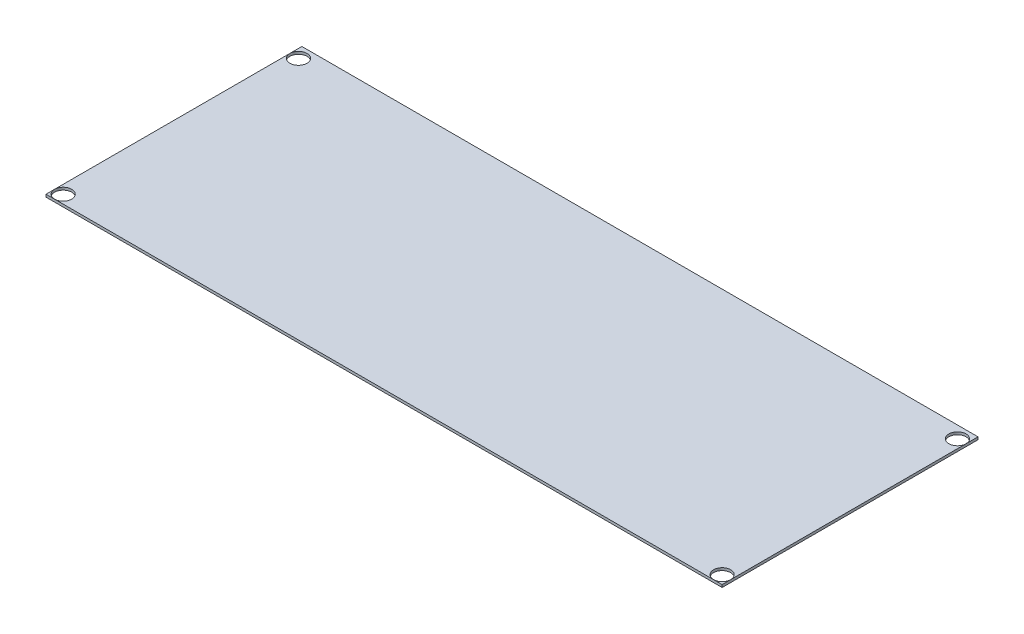
ISO-10303-21;
HEADER;
FILE_DESCRIPTION(('STEP AP214'),'2;1');
FILE_NAME('part.step','',(''),(''),'','','');
FILE_SCHEMA(('AUTOMOTIVE_DESIGN { 1 0 10303 214 1 1 1 1 }'));
ENDSEC;
DATA;
#1=APPLICATION_CONTEXT('core data for automotive mechanical design processes');
#2=APPLICATION_PROTOCOL_DEFINITION('international standard','automotive_design',2000,#1);
#3=PRODUCT_CONTEXT('',#1,'mechanical');
#4=PRODUCT('Part','Part','',(#3));
#5=PRODUCT_RELATED_PRODUCT_CATEGORY('part','',(#4));
#6=PRODUCT_DEFINITION_FORMATION('','',#4);
#7=PRODUCT_DEFINITION_CONTEXT('part definition',#1,'design');
#8=PRODUCT_DEFINITION('design','',#6,#7);
#9=PRODUCT_DEFINITION_SHAPE('','',#8);
#10=(LENGTH_UNIT() NAMED_UNIT(*) SI_UNIT(.MILLI.,.METRE.));
#11=(NAMED_UNIT(*) PLANE_ANGLE_UNIT() SI_UNIT($,.RADIAN.));
#12=(NAMED_UNIT(*) SI_UNIT($,.STERADIAN.) SOLID_ANGLE_UNIT());
#13=UNCERTAINTY_MEASURE_WITH_UNIT(LENGTH_MEASURE(1.E-05),#10,'distance_accuracy_value','');
#14=(GEOMETRIC_REPRESENTATION_CONTEXT(3) GLOBAL_UNCERTAINTY_ASSIGNED_CONTEXT((#13)) GLOBAL_UNIT_ASSIGNED_CONTEXT((#10,
#11,#12)) REPRESENTATION_CONTEXT('',''));
#15=CARTESIAN_POINT('',(0.,0.,0.));
#16=DIRECTION('',(0.,0.,1.));
#17=DIRECTION('',(1.,0.,0.));
#18=AXIS2_PLACEMENT_3D('',#15,#16,#17);
#19=CARTESIAN_POINT('',(4.44089209850063E-13,1.24359290226694E-10,0.));
#20=DIRECTION('',(0.,0.,-1.));
#21=DIRECTION('',(1.,6.22399701222243E-13,0.));
#22=AXIS2_PLACEMENT_3D('',#19,#20,#21);
#23=PLANE('',#22);
#24=DIRECTION('',(-1.,-6.22399701222243E-13,0.));
#25=VECTOR('',#24,1.);
#26=CARTESIAN_POINT('',(-1.4432899320127E-12,3.00000000012436,0.));
#27=LINE('',#26,#25);
#28=CARTESIAN_POINT('',(395.01,3.00000000037021,0.));
#29=VERTEX_POINT('',#28);
#30=CARTESIAN_POINT('',(-395.010000000001,2.99999999987845,0.));
#31=VERTEX_POINT('',#30);
#32=EDGE_CURVE('E128',#29,#31,#27,.T.);
#33=ORIENTED_EDGE('',*,*,#32,.T.);
#34=DIRECTION('',(-6.29126380620922E-13,1.,0.));
#35=VECTOR('',#34,1.);
#36=CARTESIAN_POINT('',(-395.009999999999,-1.21550614885779E-10,0.));
#37=LINE('',#36,#35);
#38=CARTESIAN_POINT('',(-395.009999999999,-1.21550614885779E-10,0.));
#39=VERTEX_POINT('',#38);
#40=EDGE_CURVE('E61',#39,#31,#37,.T.);
#41=ORIENTED_EDGE('',*,*,#40,.F.);
#42=DIRECTION('',(-1.,-6.22399701222243E-13,0.));
#43=VECTOR('',#42,1.);
#44=CARTESIAN_POINT('',(4.44089209850063E-13,1.24359290226694E-10,0.));
#45=LINE('',#44,#43);
#46=CARTESIAN_POINT('',(395.01,3.70213396206492E-10,0.));
#47=VERTEX_POINT('',#46);
#48=EDGE_CURVE('E87',#47,#39,#45,.T.);
#49=ORIENTED_EDGE('',*,*,#48,.F.);
#50=DIRECTION('',(0.,-1.,0.));
#51=VECTOR('',#50,1.);
#52=CARTESIAN_POINT('',(395.01,3.,0.));
#53=LINE('',#52,#51);
#54=EDGE_CURVE('E102',#29,#47,#53,.T.);
#55=ORIENTED_EDGE('',*,*,#54,.F.);
#56=EDGE_LOOP('',(#33,#41,#49,#55));
#57=FACE_BOUND('',#56,.T.);
#58=ADVANCED_FACE('F42',(#57),#23,.F.);
#59=CARTESIAN_POINT('',(4.9960036108132E-13,1.24359290226694E-10,-299.));
#60=DIRECTION('',(0.,0.,1.));
#61=DIRECTION('',(-1.,-6.22399701222243E-13,0.));
#62=AXIS2_PLACEMENT_3D('',#59,#60,#61);
#63=PLANE('',#62);
#64=DIRECTION('',(1.,6.22399701222243E-13,0.));
#65=VECTOR('',#64,1.);
#66=CARTESIAN_POINT('',(4.9960036108132E-13,1.24359290226694E-10,-299.));
#67=LINE('',#66,#65);
#68=CARTESIAN_POINT('',(-395.009999999999,-1.21550658253866E-10,-299.));
#69=VERTEX_POINT('',#68);
#70=CARTESIAN_POINT('',(395.01,3.70213396206492E-10,-299.));
#71=VERTEX_POINT('',#70);
#72=EDGE_CURVE('E52',#69,#71,#67,.T.);
#73=ORIENTED_EDGE('',*,*,#72,.F.);
#74=DIRECTION('',(6.23767765351557E-13,-1.,0.));
#75=VECTOR('',#74,1.);
#76=CARTESIAN_POINT('',(-395.009999999999,-1.21550658253866E-10,-299.));
#77=LINE('',#76,#75);
#78=CARTESIAN_POINT('',(-395.010000000001,2.99999999987845,-299.));
#79=VERTEX_POINT('',#78);
#80=EDGE_CURVE('E73',#79,#69,#77,.T.);
#81=ORIENTED_EDGE('',*,*,#80,.F.);
#82=DIRECTION('',(1.,6.22399701222243E-13,0.));
#83=VECTOR('',#82,1.);
#84=CARTESIAN_POINT('',(-1.38777878078145E-12,3.00000000012436,-299.));
#85=LINE('',#84,#83);
#86=CARTESIAN_POINT('',(395.01,3.00000000037021,-299.));
#87=VERTEX_POINT('',#86);
#88=EDGE_CURVE('E93',#79,#87,#85,.T.);
#89=ORIENTED_EDGE('',*,*,#88,.T.);
#90=DIRECTION('',(0.,-1.,0.));
#91=VECTOR('',#90,1.);
#92=CARTESIAN_POINT('',(395.01,3.,-299.));
#93=LINE('',#92,#91);
#94=EDGE_CURVE('E91',#87,#71,#93,.T.);
#95=ORIENTED_EDGE('',*,*,#94,.T.);
#96=EDGE_LOOP('',(#73,#81,#89,#95));
#97=FACE_BOUND('',#96,.T.);
#98=ADVANCED_FACE('F89',(#97),#63,.F.);
#99=CARTESIAN_POINT('',(4.9960036108132E-13,1.24359290226694E-10,0.));
#100=DIRECTION('',(6.22399701222243E-13,-1.,0.));
#101=DIRECTION('',(0.,0.,1.));
#102=AXIS2_PLACEMENT_3D('',#99,#100,#101);
#103=PLANE('',#102);
#104=DIRECTION('',(0.,0.,1.));
#105=VECTOR('',#104,1.);
#106=CARTESIAN_POINT('',(-395.009999999999,-1.21550658253866E-10,-299.));
#107=LINE('',#106,#105);
#108=EDGE_CURVE('E46',#69,#39,#107,.T.);
#109=ORIENTED_EDGE('',*,*,#108,.F.);
#110=ORIENTED_EDGE('',*,*,#72,.T.);
#111=DIRECTION('',(0.,0.,-1.));
#112=VECTOR('',#111,1.);
#113=CARTESIAN_POINT('',(395.01,0.,-300.));
#114=LINE('',#113,#112);
#115=EDGE_CURVE('E98',#47,#71,#114,.T.);
#116=ORIENTED_EDGE('',*,*,#115,.F.);
#117=ORIENTED_EDGE('',*,*,#48,.T.);
#118=EDGE_LOOP('',(#109,#110,#116,#117));
#119=FACE_BOUND('',#118,.T.);
#120=CARTESIAN_POINT('',(-384.999999999999,-1.15264568723017E-10,-10.0499999999999));
#121=DIRECTION('',(6.22399701222243E-13,-1.,0.));
#122=DIRECTION('',(0.,0.,1.));
#123=AXIS2_PLACEMENT_3D('',#120,#121,#122);
#124=CIRCLE('',#123,9.99999999999998);
#125=CARTESIAN_POINT('',(-384.999999999999,-1.15265436084755E-10,-0.0499999999999112));
#126=VERTEX_POINT('',#125);
#127=EDGE_CURVE('E122',#126,#126,#124,.T.);
#128=ORIENTED_EDGE('',*,*,#127,.F.);
#129=EDGE_LOOP('',(#128));
#130=FACE_BOUND('',#129,.T.);
#131=CARTESIAN_POINT('',(-384.999999999999,-1.15264568723017E-10,-285.));
#132=DIRECTION('',(6.22399701222243E-13,-1.,0.));
#133=DIRECTION('',(0.,0.,1.));
#134=AXIS2_PLACEMENT_3D('',#131,#132,#133);
#135=CIRCLE('',#134,9.99999999999998);
#136=CARTESIAN_POINT('',(-384.999999999999,-1.15265436084755E-10,-275.));
#137=VERTEX_POINT('',#136);
#138=EDGE_CURVE('E105',#137,#137,#135,.T.);
#139=ORIENTED_EDGE('',*,*,#138,.F.);
#140=EDGE_LOOP('',(#139));
#141=FACE_BOUND('',#140,.T.);
#142=CARTESIAN_POINT('',(385.,0.,-10.0499999999999));
#143=DIRECTION('',(0.,1.,0.));
#144=DIRECTION('',(0.,0.,1.));
#145=AXIS2_PLACEMENT_3D('',#142,#143,#144);
#146=CIRCLE('',#145,9.99999999999998);
#147=CARTESIAN_POINT('',(385.,0.,-0.0499999999999112));
#148=VERTEX_POINT('',#147);
#149=EDGE_CURVE('E101',#148,#148,#146,.T.);
#150=ORIENTED_EDGE('',*,*,#149,.T.);
#151=EDGE_LOOP('',(#150));
#152=FACE_BOUND('',#151,.T.);
#153=CARTESIAN_POINT('',(385.,0.,-285.));
#154=DIRECTION('',(0.,1.,0.));
#155=DIRECTION('',(0.,0.,1.));
#156=AXIS2_PLACEMENT_3D('',#153,#154,#155);
#157=CIRCLE('',#156,9.99999999999998);
#158=CARTESIAN_POINT('',(385.,0.,-275.));
#159=VERTEX_POINT('',#158);
#160=EDGE_CURVE('E115',#159,#159,#157,.T.);
#161=ORIENTED_EDGE('',*,*,#160,.T.);
#162=EDGE_LOOP('',(#161));
#163=FACE_BOUND('',#162,.T.);
#164=ADVANCED_FACE('F81',(#119,#130,#141,#152,#163),#103,.T.);
#165=CARTESIAN_POINT('',(-1.38777878078145E-12,3.00000000012436,0.));
#166=DIRECTION('',(6.22399701222243E-13,-1.,0.));
#167=DIRECTION('',(0.,0.,1.));
#168=AXIS2_PLACEMENT_3D('',#165,#166,#167);
#169=PLANE('',#168);
#170=CARTESIAN_POINT('',(-385.000000000001,2.99999999988473,-10.0499999999999));
#171=DIRECTION('',(6.22399701222243E-13,-1.,0.));
#172=DIRECTION('',(0.,0.,1.));
#173=AXIS2_PLACEMENT_3D('',#170,#171,#172);
#174=CIRCLE('',#173,9.99999999999998);
#175=CARTESIAN_POINT('',(-385.000000000001,2.99999999988473,-0.0499999999999112));
#176=VERTEX_POINT('',#175);
#177=EDGE_CURVE('E131',#176,#176,#174,.T.);
#178=ORIENTED_EDGE('',*,*,#177,.T.);
#179=EDGE_LOOP('',(#178));
#180=FACE_BOUND('',#179,.T.);
#181=CARTESIAN_POINT('',(-385.000000000001,2.99999999988473,-285.));
#182=DIRECTION('',(6.22399701222243E-13,-1.,0.));
#183=DIRECTION('',(0.,0.,1.));
#184=AXIS2_PLACEMENT_3D('',#181,#182,#183);
#185=CIRCLE('',#184,9.99999999999998);
#186=CARTESIAN_POINT('',(-385.000000000001,2.99999999988473,-275.));
#187=VERTEX_POINT('',#186);
#188=EDGE_CURVE('E125',#187,#187,#185,.T.);
#189=ORIENTED_EDGE('',*,*,#188,.T.);
#190=EDGE_LOOP('',(#189));
#191=FACE_BOUND('',#190,.T.);
#192=ORIENTED_EDGE('',*,*,#88,.F.);
#193=DIRECTION('',(0.,0.,1.));
#194=VECTOR('',#193,1.);
#195=CARTESIAN_POINT('',(-395.010000000001,2.99999999987845,0.));
#196=LINE('',#195,#194);
#197=EDGE_CURVE('E12',#79,#31,#196,.T.);
#198=ORIENTED_EDGE('',*,*,#197,.T.);
#199=ORIENTED_EDGE('',*,*,#32,.F.);
#200=DIRECTION('',(0.,0.,-1.));
#201=VECTOR('',#200,1.);
#202=CARTESIAN_POINT('',(395.01,3.,-300.));
#203=LINE('',#202,#201);
#204=EDGE_CURVE('E100',#29,#87,#203,.T.);
#205=ORIENTED_EDGE('',*,*,#204,.T.);
#206=EDGE_LOOP('',(#192,#198,#199,#205));
#207=FACE_BOUND('',#206,.T.);
#208=CARTESIAN_POINT('',(385.,3.,-10.0499999999999));
#209=DIRECTION('',(0.,1.,0.));
#210=DIRECTION('',(0.,0.,1.));
#211=AXIS2_PLACEMENT_3D('',#208,#209,#210);
#212=CIRCLE('',#211,9.99999999999998);
#213=CARTESIAN_POINT('',(385.,3.,-0.0499999999999112));
#214=VERTEX_POINT('',#213);
#215=EDGE_CURVE('E110',#214,#214,#212,.T.);
#216=ORIENTED_EDGE('',*,*,#215,.F.);
#217=EDGE_LOOP('',(#216));
#218=FACE_BOUND('',#217,.T.);
#219=CARTESIAN_POINT('',(385.,3.,-285.));
#220=DIRECTION('',(0.,1.,0.));
#221=DIRECTION('',(0.,0.,1.));
#222=AXIS2_PLACEMENT_3D('',#219,#220,#221);
#223=CIRCLE('',#222,9.99999999999998);
#224=CARTESIAN_POINT('',(385.,3.,-275.));
#225=VERTEX_POINT('',#224);
#226=EDGE_CURVE('E108',#225,#225,#223,.T.);
#227=ORIENTED_EDGE('',*,*,#226,.F.);
#228=EDGE_LOOP('',(#227));
#229=FACE_BOUND('',#228,.T.);
#230=ADVANCED_FACE('F136',(#180,#191,#207,#218,#229),#169,.F.);
#231=CARTESIAN_POINT('',(-385.000000000006,9.99999999988473,-285.));
#232=DIRECTION('',(6.22399701222243E-13,-1.,0.));
#233=DIRECTION('',(0.,0.,1.));
#234=AXIS2_PLACEMENT_3D('',#231,#232,#233);
#235=CYLINDRICAL_SURFACE('',#234,9.99999999999998);
#236=CARTESIAN_POINT('',(-384.999999999999,-1.15265436084755E-10,-275.));
#237=CARTESIAN_POINT('',(-384.999999999999,0.0312499998847346,-275.));
#238=CARTESIAN_POINT('',(-385.,0.0624999998847346,-275.));
#239=CARTESIAN_POINT('',(-385.,0.124999999884735,-275.));
#240=CARTESIAN_POINT('',(-385.,0.156249999884735,-275.));
#241=CARTESIAN_POINT('',(-385.,0.218749999884735,-275.));
#242=CARTESIAN_POINT('',(-385.,0.249999999884735,-275.));
#243=CARTESIAN_POINT('',(-385.,0.312499999884735,-275.));
#244=CARTESIAN_POINT('',(-385.,0.343749999884735,-275.));
#245=CARTESIAN_POINT('',(-385.,0.406249999884735,-275.));
#246=CARTESIAN_POINT('',(-385.,0.437499999884735,-275.));
#247=CARTESIAN_POINT('',(-385.,0.499999999884735,-275.));
#248=CARTESIAN_POINT('',(-385.,0.531249999884735,-275.));
#249=CARTESIAN_POINT('',(-385.,0.593749999884735,-275.));
#250=CARTESIAN_POINT('',(-385.,0.624999999884735,-275.));
#251=CARTESIAN_POINT('',(-385.,0.687499999884735,-275.));
#252=CARTESIAN_POINT('',(-385.,0.718749999884735,-275.));
#253=CARTESIAN_POINT('',(-385.,0.781249999884735,-275.));
#254=CARTESIAN_POINT('',(-385.,0.812499999884735,-275.));
#255=CARTESIAN_POINT('',(-385.,0.874999999884735,-275.));
#256=CARTESIAN_POINT('',(-385.,0.906249999884735,-275.));
#257=CARTESIAN_POINT('',(-385.,0.968749999884735,-275.));
#258=CARTESIAN_POINT('',(-385.,0.999999999884735,-275.));
#259=CARTESIAN_POINT('',(-385.,1.06249999988474,-275.));
#260=CARTESIAN_POINT('',(-385.,1.09374999988474,-275.));
#261=CARTESIAN_POINT('',(-385.,1.15624999988474,-275.));
#262=CARTESIAN_POINT('',(-385.,1.18749999988474,-275.));
#263=CARTESIAN_POINT('',(-385.,1.24999999988474,-275.));
#264=CARTESIAN_POINT('',(-385.,1.28124999988474,-275.));
#265=CARTESIAN_POINT('',(-385.,1.34374999988474,-275.));
#266=CARTESIAN_POINT('',(-385.,1.37499999988474,-275.));
#267=CARTESIAN_POINT('',(-385.,1.43749999988474,-275.));
#268=CARTESIAN_POINT('',(-385.,1.46874999988474,-275.));
#269=CARTESIAN_POINT('',(-385.,1.53124999988474,-275.));
#270=CARTESIAN_POINT('',(-385.000000000001,1.56249999988474,-275.));
#271=CARTESIAN_POINT('',(-385.000000000001,1.62499999988474,-275.));
#272=CARTESIAN_POINT('',(-385.000000000001,1.65624999988474,-275.));
#273=CARTESIAN_POINT('',(-385.000000000001,1.71874999988474,-275.));
#274=CARTESIAN_POINT('',(-385.000000000001,1.74999999988474,-275.));
#275=CARTESIAN_POINT('',(-385.000000000001,1.81249999988473,-275.));
#276=CARTESIAN_POINT('',(-385.000000000001,1.84374999988473,-275.));
#277=CARTESIAN_POINT('',(-385.000000000001,1.90624999988473,-275.));
#278=CARTESIAN_POINT('',(-385.000000000001,1.93749999988473,-275.));
#279=CARTESIAN_POINT('',(-385.000000000001,1.99999999988473,-275.));
#280=CARTESIAN_POINT('',(-385.000000000001,2.03124999988473,-275.));
#281=CARTESIAN_POINT('',(-385.000000000001,2.09374999988473,-275.));
#282=CARTESIAN_POINT('',(-385.000000000001,2.12499999988473,-275.));
#283=CARTESIAN_POINT('',(-385.000000000001,2.18749999988473,-275.));
#284=CARTESIAN_POINT('',(-385.000000000001,2.21874999988473,-275.));
#285=CARTESIAN_POINT('',(-385.000000000001,2.28124999988473,-275.));
#286=CARTESIAN_POINT('',(-385.000000000001,2.31249999988473,-275.));
#287=CARTESIAN_POINT('',(-385.000000000001,2.37499999988473,-275.));
#288=CARTESIAN_POINT('',(-385.000000000001,2.40624999988473,-275.));
#289=CARTESIAN_POINT('',(-385.000000000001,2.46874999988473,-275.));
#290=CARTESIAN_POINT('',(-385.000000000001,2.49999999988473,-275.));
#291=CARTESIAN_POINT('',(-385.000000000001,2.56249999988473,-275.));
#292=CARTESIAN_POINT('',(-385.000000000001,2.59374999988473,-275.));
#293=CARTESIAN_POINT('',(-385.000000000001,2.65624999988473,-275.));
#294=CARTESIAN_POINT('',(-385.000000000001,2.68749999988473,-275.));
#295=CARTESIAN_POINT('',(-385.000000000001,2.74999999988473,-275.));
#296=CARTESIAN_POINT('',(-385.000000000001,2.78124999988473,-275.));
#297=CARTESIAN_POINT('',(-385.000000000001,2.84374999988473,-275.));
#298=CARTESIAN_POINT('',(-385.000000000001,2.87499999988473,-275.));
#299=CARTESIAN_POINT('',(-385.000000000001,2.93749999988473,-275.));
#300=CARTESIAN_POINT('',(-385.000000000001,2.96874999988473,-275.));
#301=CARTESIAN_POINT('',(-385.000000000001,2.99999999988473,-275.));
#302=B_SPLINE_CURVE_WITH_KNOTS('',3,(#236,#237,#238,#239,#240,#241,#242,#243,#244,#245,#246,
#247,#248,#249,#250,#251,#252,#253,#254,#255,#256,#257,#258,#259,#260,#261,#262,#263,#264,#265,
#266,#267,#268,#269,#270,#271,#272,#273,#274,#275,#276,#277,#278,#279,#280,#281,#282,#283,#284,
#285,#286,#287,#288,#289,#290,#291,#292,#293,#294,#295,#296,#297,#298,#299,#300,#301),
.UNSPECIFIED.,.F.,.F.,(4,2,2,2,2,2,2,2,2,2,2,2,2,2,2,2,2,2,2,2,2,2,2,2,2,2,2,2,2,2,2,2,4),(0.,
0.0937500000000001,0.1875,0.28125,0.375,0.46875,0.5625,0.656250000000001,0.750000000000001,
0.843750000000001,0.937500000000001,1.03125,1.125,1.21875,1.3125,1.40625,1.5,1.59375,1.6875,
1.78125,1.875,1.96875,2.0625,2.15625,2.25,2.34375,2.4375,2.53125,2.625,2.71875,2.8125,2.90625,
3.),.UNSPECIFIED.);
#303=EDGE_CURVE('BSEAM142',#137,#187,#302,.T.);
#304=ORIENTED_EDGE('',*,*,#138,.T.);
#305=ORIENTED_EDGE('',*,*,#188,.F.);
#306=ORIENTED_EDGE('',*,*,#303,.T.);
#307=ORIENTED_EDGE('',*,*,#303,.F.);
#308=EDGE_LOOP('',(#304,#306,#305,#307));
#309=FACE_BOUND('',#308,.T.);
#310=ADVANCED_FACE('F142',(#309),#235,.F.);
#311=CARTESIAN_POINT('',(-385.000000000006,9.99999999988473,-10.0499999999999));
#312=DIRECTION('',(6.22399701222243E-13,-1.,0.));
#313=DIRECTION('',(0.,0.,1.));
#314=AXIS2_PLACEMENT_3D('',#311,#312,#313);
#315=CYLINDRICAL_SURFACE('',#314,9.99999999999998);
#316=CARTESIAN_POINT('',(-384.999999999999,-1.15265436084755E-10,-0.0499999999999112));
#317=CARTESIAN_POINT('',(-384.999999999999,0.0312499998847346,-0.0499999999999112));
#318=CARTESIAN_POINT('',(-385.,0.0624999998847346,-0.0499999999999112));
#319=CARTESIAN_POINT('',(-385.,0.124999999884735,-0.0499999999999112));
#320=CARTESIAN_POINT('',(-385.,0.156249999884735,-0.0499999999999112));
#321=CARTESIAN_POINT('',(-385.,0.218749999884735,-0.0499999999999112));
#322=CARTESIAN_POINT('',(-385.,0.249999999884735,-0.0499999999999112));
#323=CARTESIAN_POINT('',(-385.,0.312499999884735,-0.0499999999999112));
#324=CARTESIAN_POINT('',(-385.,0.343749999884735,-0.0499999999999112));
#325=CARTESIAN_POINT('',(-385.,0.406249999884735,-0.0499999999999112));
#326=CARTESIAN_POINT('',(-385.,0.437499999884735,-0.0499999999999112));
#327=CARTESIAN_POINT('',(-385.,0.499999999884735,-0.0499999999999112));
#328=CARTESIAN_POINT('',(-385.,0.531249999884735,-0.0499999999999112));
#329=CARTESIAN_POINT('',(-385.,0.593749999884735,-0.0499999999999112));
#330=CARTESIAN_POINT('',(-385.,0.624999999884735,-0.0499999999999112));
#331=CARTESIAN_POINT('',(-385.,0.687499999884735,-0.0499999999999112));
#332=CARTESIAN_POINT('',(-385.,0.718749999884735,-0.0499999999999112));
#333=CARTESIAN_POINT('',(-385.,0.781249999884735,-0.0499999999999112));
#334=CARTESIAN_POINT('',(-385.,0.812499999884735,-0.0499999999999112));
#335=CARTESIAN_POINT('',(-385.,0.874999999884735,-0.0499999999999112));
#336=CARTESIAN_POINT('',(-385.,0.906249999884735,-0.0499999999999112));
#337=CARTESIAN_POINT('',(-385.,0.968749999884735,-0.0499999999999112));
#338=CARTESIAN_POINT('',(-385.,0.999999999884735,-0.0499999999999112));
#339=CARTESIAN_POINT('',(-385.,1.06249999988474,-0.0499999999999112));
#340=CARTESIAN_POINT('',(-385.,1.09374999988474,-0.0499999999999112));
#341=CARTESIAN_POINT('',(-385.,1.15624999988474,-0.0499999999999112));
#342=CARTESIAN_POINT('',(-385.,1.18749999988474,-0.0499999999999112));
#343=CARTESIAN_POINT('',(-385.,1.24999999988474,-0.0499999999999112));
#344=CARTESIAN_POINT('',(-385.,1.28124999988474,-0.0499999999999112));
#345=CARTESIAN_POINT('',(-385.,1.34374999988474,-0.0499999999999112));
#346=CARTESIAN_POINT('',(-385.,1.37499999988474,-0.0499999999999112));
#347=CARTESIAN_POINT('',(-385.,1.43749999988474,-0.0499999999999112));
#348=CARTESIAN_POINT('',(-385.,1.46874999988474,-0.0499999999999112));
#349=CARTESIAN_POINT('',(-385.,1.53124999988474,-0.0499999999999112));
#350=CARTESIAN_POINT('',(-385.000000000001,1.56249999988474,-0.0499999999999112));
#351=CARTESIAN_POINT('',(-385.000000000001,1.62499999988474,-0.0499999999999112));
#352=CARTESIAN_POINT('',(-385.000000000001,1.65624999988474,-0.0499999999999112));
#353=CARTESIAN_POINT('',(-385.000000000001,1.71874999988474,-0.0499999999999112));
#354=CARTESIAN_POINT('',(-385.000000000001,1.74999999988474,-0.0499999999999112));
#355=CARTESIAN_POINT('',(-385.000000000001,1.81249999988473,-0.0499999999999112));
#356=CARTESIAN_POINT('',(-385.000000000001,1.84374999988473,-0.0499999999999112));
#357=CARTESIAN_POINT('',(-385.000000000001,1.90624999988473,-0.0499999999999112));
#358=CARTESIAN_POINT('',(-385.000000000001,1.93749999988473,-0.0499999999999112));
#359=CARTESIAN_POINT('',(-385.000000000001,1.99999999988473,-0.0499999999999112));
#360=CARTESIAN_POINT('',(-385.000000000001,2.03124999988473,-0.0499999999999112));
#361=CARTESIAN_POINT('',(-385.000000000001,2.09374999988473,-0.0499999999999112));
#362=CARTESIAN_POINT('',(-385.000000000001,2.12499999988473,-0.0499999999999112));
#363=CARTESIAN_POINT('',(-385.000000000001,2.18749999988473,-0.0499999999999112));
#364=CARTESIAN_POINT('',(-385.000000000001,2.21874999988473,-0.0499999999999112));
#365=CARTESIAN_POINT('',(-385.000000000001,2.28124999988473,-0.0499999999999112));
#366=CARTESIAN_POINT('',(-385.000000000001,2.31249999988473,-0.0499999999999112));
#367=CARTESIAN_POINT('',(-385.000000000001,2.37499999988473,-0.0499999999999112));
#368=CARTESIAN_POINT('',(-385.000000000001,2.40624999988473,-0.0499999999999112));
#369=CARTESIAN_POINT('',(-385.000000000001,2.46874999988473,-0.0499999999999112));
#370=CARTESIAN_POINT('',(-385.000000000001,2.49999999988473,-0.0499999999999112));
#371=CARTESIAN_POINT('',(-385.000000000001,2.56249999988473,-0.0499999999999112));
#372=CARTESIAN_POINT('',(-385.000000000001,2.59374999988473,-0.0499999999999112));
#373=CARTESIAN_POINT('',(-385.000000000001,2.65624999988473,-0.0499999999999112));
#374=CARTESIAN_POINT('',(-385.000000000001,2.68749999988473,-0.0499999999999112));
#375=CARTESIAN_POINT('',(-385.000000000001,2.74999999988473,-0.0499999999999112));
#376=CARTESIAN_POINT('',(-385.000000000001,2.78124999988473,-0.0499999999999112));
#377=CARTESIAN_POINT('',(-385.000000000001,2.84374999988473,-0.0499999999999112));
#378=CARTESIAN_POINT('',(-385.000000000001,2.87499999988473,-0.0499999999999112));
#379=CARTESIAN_POINT('',(-385.000000000001,2.93749999988473,-0.0499999999999112));
#380=CARTESIAN_POINT('',(-385.000000000001,2.96874999988473,-0.0499999999999112));
#381=CARTESIAN_POINT('',(-385.000000000001,2.99999999988473,-0.0499999999999112));
#382=B_SPLINE_CURVE_WITH_KNOTS('',3,(#316,#317,#318,#319,#320,#321,#322,#323,#324,#325,#326,
#327,#328,#329,#330,#331,#332,#333,#334,#335,#336,#337,#338,#339,#340,#341,#342,#343,#344,#345,
#346,#347,#348,#349,#350,#351,#352,#353,#354,#355,#356,#357,#358,#359,#360,#361,#362,#363,#364,
#365,#366,#367,#368,#369,#370,#371,#372,#373,#374,#375,#376,#377,#378,#379,#380,#381),
.UNSPECIFIED.,.F.,.F.,(4,2,2,2,2,2,2,2,2,2,2,2,2,2,2,2,2,2,2,2,2,2,2,2,2,2,2,2,2,2,2,2,4),(0.,
0.0937500000000001,0.1875,0.28125,0.375,0.46875,0.5625,0.656250000000001,0.750000000000001,
0.843750000000001,0.937500000000001,1.03125,1.125,1.21875,1.3125,1.40625,1.5,1.59375,1.6875,
1.78125,1.875,1.96875,2.0625,2.15625,2.25,2.34375,2.4375,2.53125,2.625,2.71875,2.8125,2.90625,
3.),.UNSPECIFIED.);
#383=EDGE_CURVE('BSEAM139',#126,#176,#382,.T.);
#384=ORIENTED_EDGE('',*,*,#127,.T.);
#385=ORIENTED_EDGE('',*,*,#177,.F.);
#386=ORIENTED_EDGE('',*,*,#383,.T.);
#387=ORIENTED_EDGE('',*,*,#383,.F.);
#388=EDGE_LOOP('',(#384,#386,#385,#387));
#389=FACE_BOUND('',#388,.T.);
#390=ADVANCED_FACE('F139',(#389),#315,.F.);
#391=CARTESIAN_POINT('',(395.01,3.,-300.));
#392=DIRECTION('',(-1.,0.,0.));
#393=DIRECTION('',(0.,0.,1.));
#394=AXIS2_PLACEMENT_3D('',#391,#392,#393);
#395=PLANE('',#394);
#396=ORIENTED_EDGE('',*,*,#115,.T.);
#397=ORIENTED_EDGE('',*,*,#94,.F.);
#398=ORIENTED_EDGE('',*,*,#204,.F.);
#399=ORIENTED_EDGE('',*,*,#54,.T.);
#400=EDGE_LOOP('',(#396,#397,#398,#399));
#401=FACE_BOUND('',#400,.T.);
#402=ADVANCED_FACE('F141',(#401),#395,.F.);
#403=CARTESIAN_POINT('',(385.,-7.,-285.));
#404=DIRECTION('',(0.,1.,0.));
#405=DIRECTION('',(0.,0.,1.));
#406=AXIS2_PLACEMENT_3D('',#403,#404,#405);
#407=CYLINDRICAL_SURFACE('',#406,9.99999999999998);
#408=ORIENTED_EDGE('',*,*,#226,.T.);
#409=EDGE_LOOP('',(#408));
#410=FACE_BOUND('',#409,.T.);
#411=ORIENTED_EDGE('',*,*,#160,.F.);
#412=EDGE_LOOP('',(#411));
#413=FACE_BOUND('',#412,.T.);
#414=ADVANCED_FACE('F149',(#410,#413),#407,.F.);
#415=CARTESIAN_POINT('',(385.,-7.,-10.0499999999999));
#416=DIRECTION('',(0.,1.,0.));
#417=DIRECTION('',(0.,0.,1.));
#418=AXIS2_PLACEMENT_3D('',#415,#416,#417);
#419=CYLINDRICAL_SURFACE('',#418,9.99999999999998);
#420=ORIENTED_EDGE('',*,*,#215,.T.);
#421=EDGE_LOOP('',(#420));
#422=FACE_BOUND('',#421,.T.);
#423=ORIENTED_EDGE('',*,*,#149,.F.);
#424=EDGE_LOOP('',(#423));
#425=FACE_BOUND('',#424,.T.);
#426=ADVANCED_FACE('F203',(#422,#425),#419,.F.);
#427=CARTESIAN_POINT('',(-395.009999999999,-2.46457347604634E-10,0.));
#428=DIRECTION('',(1.,6.23767765351557E-13,0.));
#429=DIRECTION('',(-6.23767765351557E-13,1.,0.));
#430=AXIS2_PLACEMENT_3D('',#427,#428,#429);
#431=PLANE('',#430);
#432=ORIENTED_EDGE('',*,*,#80,.T.);
#433=ORIENTED_EDGE('',*,*,#108,.T.);
#434=ORIENTED_EDGE('',*,*,#40,.T.);
#435=ORIENTED_EDGE('',*,*,#197,.F.);
#436=EDGE_LOOP('',(#432,#433,#434,#435));
#437=FACE_BOUND('',#436,.T.);
#438=ADVANCED_FACE('F44',(#437),#431,.F.);
#439=CLOSED_SHELL('',(#58,#98,#164,#230,#310,#390,#402,#414,#426,#438));
#440=MANIFOLD_SOLID_BREP('B2',#439);
#441=ADVANCED_BREP_SHAPE_REPRESENTATION('',(#18,#440),#14);
#442=SHAPE_DEFINITION_REPRESENTATION(#9,#441);
ENDSEC;
END-ISO-10303-21;
